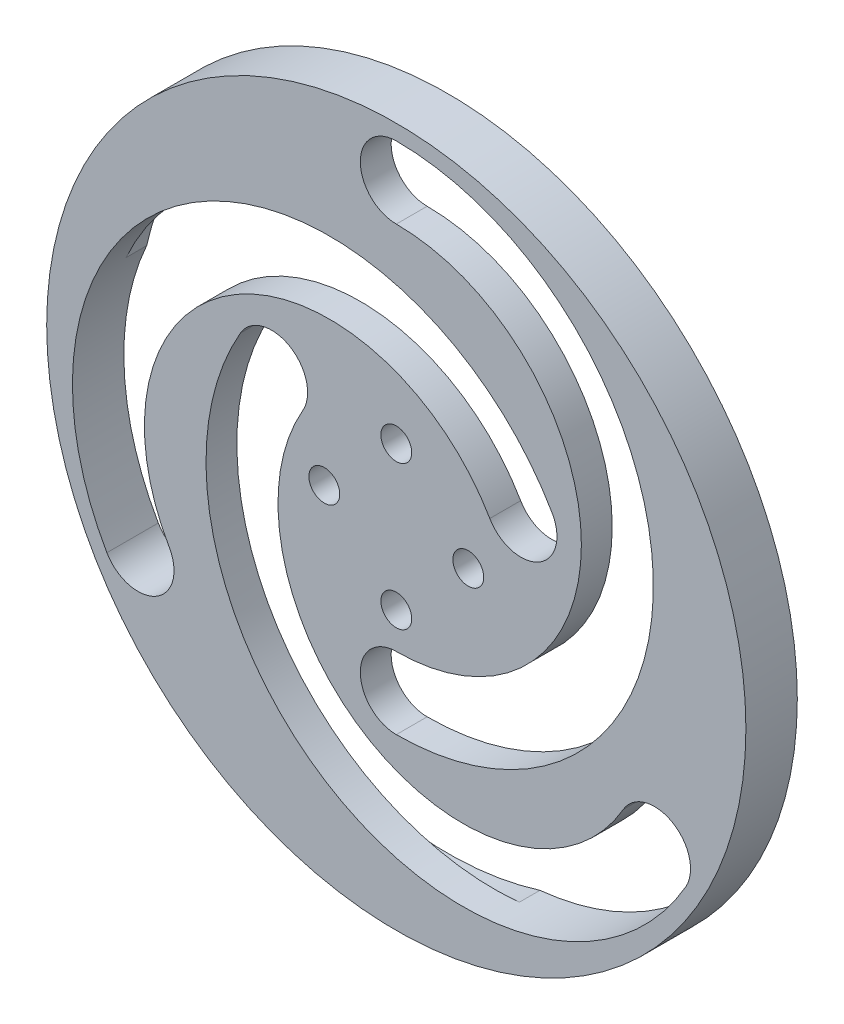
ISO-10303-21;
HEADER;
FILE_DESCRIPTION(('STEP AP214'),'2;1');
FILE_NAME('part.step','',(''),(''),'','','');
FILE_SCHEMA(('AUTOMOTIVE_DESIGN { 1 0 10303 214 1 1 1 1 }'));
ENDSEC;
DATA;
#1=APPLICATION_CONTEXT('core data for automotive mechanical design processes');
#2=APPLICATION_PROTOCOL_DEFINITION('international standard','automotive_design',2000,#1);
#3=PRODUCT_CONTEXT('',#1,'mechanical');
#4=PRODUCT('Part','Part','',(#3));
#5=PRODUCT_RELATED_PRODUCT_CATEGORY('part','',(#4));
#6=PRODUCT_DEFINITION_FORMATION('','',#4);
#7=PRODUCT_DEFINITION_CONTEXT('part definition',#1,'design');
#8=PRODUCT_DEFINITION('design','',#6,#7);
#9=PRODUCT_DEFINITION_SHAPE('','',#8);
#10=(LENGTH_UNIT() NAMED_UNIT(*) SI_UNIT(.MILLI.,.METRE.));
#11=(NAMED_UNIT(*) PLANE_ANGLE_UNIT() SI_UNIT($,.RADIAN.));
#12=(NAMED_UNIT(*) SI_UNIT($,.STERADIAN.) SOLID_ANGLE_UNIT());
#13=UNCERTAINTY_MEASURE_WITH_UNIT(LENGTH_MEASURE(1.E-05),#10,'distance_accuracy_value','');
#14=(GEOMETRIC_REPRESENTATION_CONTEXT(3) GLOBAL_UNCERTAINTY_ASSIGNED_CONTEXT((#13)) GLOBAL_UNIT_ASSIGNED_CONTEXT((#10,
#11,#12)) REPRESENTATION_CONTEXT('',''));
#15=CARTESIAN_POINT('',(0.,0.,0.));
#16=DIRECTION('',(0.,0.,1.));
#17=DIRECTION('',(1.,0.,0.));
#18=AXIS2_PLACEMENT_3D('',#15,#16,#17);
#19=CARTESIAN_POINT('',(0.,7.5,-0.00100000000000013));
#20=DIRECTION('',(0.,0.,1.));
#21=DIRECTION('',(1.,0.,0.));
#22=AXIS2_PLACEMENT_3D('',#19,#20,#21);
#23=CYLINDRICAL_SURFACE('',#22,18.);
#24=CARTESIAN_POINT('',(0.,7.5,2.));
#25=DIRECTION('',(0.,0.,-1.));
#26=DIRECTION('',(-1.,0.,0.));
#27=AXIS2_PLACEMENT_3D('',#24,#25,#26);
#28=CIRCLE('',#27,18.);
#29=CARTESIAN_POINT('',(0.,25.5,2.));
#30=VERTEX_POINT('',#29);
#31=CARTESIAN_POINT('',(0.,-10.5,2.));
#32=VERTEX_POINT('',#31);
#33=EDGE_CURVE('E324',#30,#32,#28,.T.);
#34=ORIENTED_EDGE('',*,*,#33,.F.);
#35=DIRECTION('',(0.,0.,1.));
#36=VECTOR('',#35,1.);
#37=CARTESIAN_POINT('',(0.,25.5,-0.00100000000000013));
#38=LINE('',#37,#36);
#39=CARTESIAN_POINT('',(0.,25.5,5.));
#40=VERTEX_POINT('',#39);
#41=EDGE_CURVE('E307',#30,#40,#38,.T.);
#42=ORIENTED_EDGE('',*,*,#41,.T.);
#43=CARTESIAN_POINT('',(0.,7.5,5.));
#44=DIRECTION('',(0.,0.,1.));
#45=DIRECTION('',(1.,0.,0.));
#46=AXIS2_PLACEMENT_3D('',#43,#44,#45);
#47=CIRCLE('',#46,18.);
#48=CARTESIAN_POINT('',(0.,-10.5,5.));
#49=VERTEX_POINT('',#48);
#50=EDGE_CURVE('E300',#40,#49,#47,.F.);
#51=ORIENTED_EDGE('',*,*,#50,.T.);
#52=DIRECTION('',(0.,0.,1.));
#53=VECTOR('',#52,1.);
#54=CARTESIAN_POINT('',(0.,-10.5,-0.00100000000000013));
#55=LINE('',#54,#53);
#56=EDGE_CURVE('E306',#32,#49,#55,.T.);
#57=ORIENTED_EDGE('',*,*,#56,.F.);
#58=EDGE_LOOP('',(#34,#42,#51,#57));
#59=FACE_BOUND('',#58,.T.);
#60=ADVANCED_FACE('F111',(#59),#23,.T.);
#61=CARTESIAN_POINT('',(-6.49519052838333,-3.74999999999994,-0.00100000000000013));
#62=DIRECTION('',(0.,0.,1.));
#63=DIRECTION('',(1.,0.,0.));
#64=AXIS2_PLACEMENT_3D('',#61,#62,#63);
#65=CYLINDRICAL_SURFACE('',#64,17.9999999999999);
#66=CARTESIAN_POINT('',(-6.49519052838333,-3.74999999999994,2.));
#67=DIRECTION('',(0.,0.,-1.));
#68=DIRECTION('',(-1.,0.,0.));
#69=AXIS2_PLACEMENT_3D('',#66,#67,#68);
#70=CIRCLE('',#69,17.9999999999999);
#71=CARTESIAN_POINT('',(-22.0836477965029,-12.7500000000003,2.));
#72=VERTEX_POINT('',#71);
#73=CARTESIAN_POINT('',(9.09326673973653,5.24999999999985,2.));
#74=VERTEX_POINT('',#73);
#75=EDGE_CURVE('E413',#72,#74,#70,.T.);
#76=ORIENTED_EDGE('',*,*,#75,.F.);
#77=DIRECTION('',(0.,0.,1.));
#78=VECTOR('',#77,1.);
#79=CARTESIAN_POINT('',(-22.0836477965029,-12.7500000000003,-0.00100000000000013));
#80=LINE('',#79,#78);
#81=CARTESIAN_POINT('',(-22.0836477965029,-12.7500000000003,5.));
#82=VERTEX_POINT('',#81);
#83=EDGE_CURVE('E277',#72,#82,#80,.T.);
#84=ORIENTED_EDGE('',*,*,#83,.T.);
#85=CARTESIAN_POINT('',(-6.49519052838333,-3.74999999999994,5.));
#86=DIRECTION('',(0.,0.,1.));
#87=DIRECTION('',(1.,0.,0.));
#88=AXIS2_PLACEMENT_3D('',#85,#86,#87);
#89=CIRCLE('',#88,17.9999999999999);
#90=CARTESIAN_POINT('',(9.09326673973653,5.24999999999984,5.));
#91=VERTEX_POINT('',#90);
#92=EDGE_CURVE('E261',#82,#91,#89,.F.);
#93=ORIENTED_EDGE('',*,*,#92,.T.);
#94=DIRECTION('',(0.,0.,1.));
#95=VECTOR('',#94,1.);
#96=CARTESIAN_POINT('',(9.09326673973653,5.24999999999985,-0.00100000000000013));
#97=LINE('',#96,#95);
#98=EDGE_CURVE('E276',#74,#91,#97,.T.);
#99=ORIENTED_EDGE('',*,*,#98,.F.);
#100=EDGE_LOOP('',(#76,#84,#93,#99));
#101=FACE_BOUND('',#100,.T.);
#102=ADVANCED_FACE('F451',(#101),#65,.T.);
#103=CARTESIAN_POINT('',(6.49519052838327,-3.75000000000003,-0.00100000000000013));
#104=DIRECTION('',(0.,0.,1.));
#105=DIRECTION('',(1.,0.,0.));
#106=AXIS2_PLACEMENT_3D('',#103,#104,#105);
#107=CYLINDRICAL_SURFACE('',#106,18.0000000000001);
#108=CARTESIAN_POINT('',(6.49519052838327,-3.75000000000003,2.));
#109=DIRECTION('',(0.,0.,-1.));
#110=DIRECTION('',(-1.,0.,0.));
#111=AXIS2_PLACEMENT_3D('',#108,#109,#110);
#112=CIRCLE('',#111,18.0000000000001);
#113=CARTESIAN_POINT('',(22.0836477965035,-12.7499999999997,2.));
#114=VERTEX_POINT('',#113);
#115=CARTESIAN_POINT('',(-9.0932667397367,5.25000000000011,2.));
#116=VERTEX_POINT('',#115);
#117=EDGE_CURVE('E421',#114,#116,#112,.T.);
#118=ORIENTED_EDGE('',*,*,#117,.F.);
#119=DIRECTION('',(0.,0.,1.));
#120=VECTOR('',#119,1.);
#121=CARTESIAN_POINT('',(22.0836477965035,-12.7499999999997,-0.00100000000000013));
#122=LINE('',#121,#120);
#123=CARTESIAN_POINT('',(22.0836477965035,-12.7499999999997,5.));
#124=VERTEX_POINT('',#123);
#125=EDGE_CURVE('E292',#114,#124,#122,.T.);
#126=ORIENTED_EDGE('',*,*,#125,.T.);
#127=CARTESIAN_POINT('',(6.49519052838327,-3.75000000000003,5.));
#128=DIRECTION('',(0.,0.,1.));
#129=DIRECTION('',(1.,0.,0.));
#130=AXIS2_PLACEMENT_3D('',#127,#128,#129);
#131=CIRCLE('',#130,18.0000000000001);
#132=CARTESIAN_POINT('',(-9.0932667397367,5.25000000000011,5.));
#133=VERTEX_POINT('',#132);
#134=EDGE_CURVE('E285',#124,#133,#131,.F.);
#135=ORIENTED_EDGE('',*,*,#134,.T.);
#136=DIRECTION('',(0.,0.,1.));
#137=VECTOR('',#136,1.);
#138=CARTESIAN_POINT('',(-9.0932667397367,5.25000000000011,-0.00100000000000013));
#139=LINE('',#138,#137);
#140=EDGE_CURVE('E291',#116,#133,#139,.T.);
#141=ORIENTED_EDGE('',*,*,#140,.F.);
#142=EDGE_LOOP('',(#118,#126,#135,#141));
#143=FACE_BOUND('',#142,.T.);
#144=ADVANCED_FACE('F383',(#143),#107,.T.);
#145=CARTESIAN_POINT('',(0.,7.,5.001));
#146=DIRECTION('',(0.,0.,-1.));
#147=DIRECTION('',(-1.,0.,0.));
#148=AXIS2_PLACEMENT_3D('',#145,#146,#147);
#149=CYLINDRICAL_SURFACE('',#148,1.5);
#150=CARTESIAN_POINT('',(0.,7.,5.));
#151=DIRECTION('',(0.,0.,1.));
#152=DIRECTION('',(1.,0.,0.));
#153=AXIS2_PLACEMENT_3D('',#150,#151,#152);
#154=CIRCLE('',#153,1.5);
#155=CARTESIAN_POINT('',(1.49999999999993,7.,5.));
#156=VERTEX_POINT('',#155);
#157=EDGE_CURVE('E271',#156,#156,#154,.F.);
#158=ORIENTED_EDGE('',*,*,#157,.F.);
#159=EDGE_LOOP('',(#158));
#160=FACE_BOUND('',#159,.T.);
#161=CARTESIAN_POINT('',(0.,7.,2.));
#162=DIRECTION('',(0.,0.,-1.));
#163=DIRECTION('',(-1.,0.,0.));
#164=AXIS2_PLACEMENT_3D('',#161,#162,#163);
#165=CIRCLE('',#164,1.5);
#166=CARTESIAN_POINT('',(-1.50000000000007,7.,2.));
#167=VERTEX_POINT('',#166);
#168=EDGE_CURVE('E387',#167,#167,#165,.F.);
#169=ORIENTED_EDGE('',*,*,#168,.F.);
#170=EDGE_LOOP('',(#169));
#171=FACE_BOUND('',#170,.T.);
#172=ADVANCED_FACE('F379',(#160,#171),#149,.F.);
#173=CARTESIAN_POINT('',(7.,0.,5.001));
#174=DIRECTION('',(0.,0.,-1.));
#175=DIRECTION('',(-1.,0.,0.));
#176=AXIS2_PLACEMENT_3D('',#173,#174,#175);
#177=CYLINDRICAL_SURFACE('',#176,1.5);
#178=CARTESIAN_POINT('',(7.,0.,5.));
#179=DIRECTION('',(0.,0.,1.));
#180=DIRECTION('',(1.,0.,0.));
#181=AXIS2_PLACEMENT_3D('',#178,#179,#180);
#182=CIRCLE('',#181,1.5);
#183=CARTESIAN_POINT('',(8.5,0.,5.));
#184=VERTEX_POINT('',#183);
#185=EDGE_CURVE('E370',#184,#184,#182,.F.);
#186=ORIENTED_EDGE('',*,*,#185,.F.);
#187=EDGE_LOOP('',(#186));
#188=FACE_BOUND('',#187,.T.);
#189=CARTESIAN_POINT('',(7.,0.,2.));
#190=DIRECTION('',(0.,0.,-1.));
#191=DIRECTION('',(-1.,0.,0.));
#192=AXIS2_PLACEMENT_3D('',#189,#190,#191);
#193=CIRCLE('',#192,1.5);
#194=CARTESIAN_POINT('',(5.5,0.,2.));
#195=VERTEX_POINT('',#194);
#196=EDGE_CURVE('E390',#195,#195,#193,.F.);
#197=ORIENTED_EDGE('',*,*,#196,.F.);
#198=EDGE_LOOP('',(#197));
#199=FACE_BOUND('',#198,.T.);
#200=ADVANCED_FACE('F382',(#188,#199),#177,.F.);
#201=CARTESIAN_POINT('',(0.,-7.,5.001));
#202=DIRECTION('',(0.,0.,-1.));
#203=DIRECTION('',(-1.,0.,0.));
#204=AXIS2_PLACEMENT_3D('',#201,#202,#203);
#205=CYLINDRICAL_SURFACE('',#204,1.5);
#206=CARTESIAN_POINT('',(0.,-7.,5.));
#207=DIRECTION('',(0.,0.,1.));
#208=DIRECTION('',(1.,0.,0.));
#209=AXIS2_PLACEMENT_3D('',#206,#207,#208);
#210=CIRCLE('',#209,1.5);
#211=CARTESIAN_POINT('',(1.50000000000002,-7.,5.));
#212=VERTEX_POINT('',#211);
#213=EDGE_CURVE('E268',#212,#212,#210,.F.);
#214=ORIENTED_EDGE('',*,*,#213,.F.);
#215=EDGE_LOOP('',(#214));
#216=FACE_BOUND('',#215,.T.);
#217=CARTESIAN_POINT('',(0.,-7.,2.));
#218=DIRECTION('',(0.,0.,-1.));
#219=DIRECTION('',(-1.,0.,0.));
#220=AXIS2_PLACEMENT_3D('',#217,#218,#219);
#221=CIRCLE('',#220,1.5);
#222=CARTESIAN_POINT('',(-1.49999999999998,-7.,2.));
#223=VERTEX_POINT('',#222);
#224=EDGE_CURVE('E396',#223,#223,#221,.F.);
#225=ORIENTED_EDGE('',*,*,#224,.F.);
#226=EDGE_LOOP('',(#225));
#227=FACE_BOUND('',#226,.T.);
#228=ADVANCED_FACE('F435',(#216,#227),#205,.F.);
#229=CARTESIAN_POINT('',(-7.,0.,5.001));
#230=DIRECTION('',(0.,0.,-1.));
#231=DIRECTION('',(-1.,0.,0.));
#232=AXIS2_PLACEMENT_3D('',#229,#230,#231);
#233=CYLINDRICAL_SURFACE('',#232,1.5);
#234=CARTESIAN_POINT('',(-7.,0.,5.));
#235=DIRECTION('',(0.,0.,1.));
#236=DIRECTION('',(1.,0.,0.));
#237=AXIS2_PLACEMENT_3D('',#234,#235,#236);
#238=CIRCLE('',#237,1.5);
#239=CARTESIAN_POINT('',(-5.5,0.,5.));
#240=VERTEX_POINT('',#239);
#241=EDGE_CURVE('E262',#240,#240,#238,.F.);
#242=ORIENTED_EDGE('',*,*,#241,.F.);
#243=EDGE_LOOP('',(#242));
#244=FACE_BOUND('',#243,.T.);
#245=CARTESIAN_POINT('',(-7.,0.,2.));
#246=DIRECTION('',(0.,0.,-1.));
#247=DIRECTION('',(-1.,0.,0.));
#248=AXIS2_PLACEMENT_3D('',#245,#246,#247);
#249=CIRCLE('',#248,1.5);
#250=CARTESIAN_POINT('',(-8.5,0.,2.));
#251=VERTEX_POINT('',#250);
#252=EDGE_CURVE('E428',#251,#251,#249,.F.);
#253=ORIENTED_EDGE('',*,*,#252,.F.);
#254=EDGE_LOOP('',(#253));
#255=FACE_BOUND('',#254,.T.);
#256=ADVANCED_FACE('F437',(#244,#255),#233,.F.);
#257=CARTESIAN_POINT('',(-12.1243556529822,7.00000000000013,5.001));
#258=DIRECTION('',(0.,0.,-1.));
#259=DIRECTION('',(-1.,0.,0.));
#260=AXIS2_PLACEMENT_3D('',#257,#258,#259);
#261=CYLINDRICAL_SURFACE('',#260,3.5);
#262=CARTESIAN_POINT('',(-12.1243556529822,7.00000000000013,2.));
#263=DIRECTION('',(0.,0.,-1.));
#264=DIRECTION('',(-1.,0.,0.));
#265=AXIS2_PLACEMENT_3D('',#262,#263,#264);
#266=CIRCLE('',#265,3.5);
#267=CARTESIAN_POINT('',(-15.1554445662278,8.75000000000014,2.));
#268=VERTEX_POINT('',#267);
#269=EDGE_CURVE('E423',#116,#268,#266,.F.);
#270=ORIENTED_EDGE('',*,*,#269,.F.);
#271=ORIENTED_EDGE('',*,*,#140,.T.);
#272=CARTESIAN_POINT('',(-12.1243556529822,7.00000000000013,5.));
#273=DIRECTION('',(0.,0.,1.));
#274=DIRECTION('',(1.,0.,0.));
#275=AXIS2_PLACEMENT_3D('',#272,#273,#274);
#276=CIRCLE('',#275,3.5);
#277=CARTESIAN_POINT('',(-15.1554445662278,8.75000000000014,5.));
#278=VERTEX_POINT('',#277);
#279=EDGE_CURVE('E359',#278,#133,#276,.F.);
#280=ORIENTED_EDGE('',*,*,#279,.F.);
#281=DIRECTION('',(0.,0.,1.));
#282=VECTOR('',#281,1.);
#283=CARTESIAN_POINT('',(-15.1554445662278,8.75000000000014,-0.00100000000000013));
#284=LINE('',#283,#282);
#285=EDGE_CURVE('E296',#268,#278,#284,.T.);
#286=ORIENTED_EDGE('',*,*,#285,.F.);
#287=EDGE_LOOP('',(#270,#271,#280,#286));
#288=FACE_BOUND('',#287,.T.);
#289=ADVANCED_FACE('F444',(#288),#261,.F.);
#290=CARTESIAN_POINT('',(12.1243556529821,6.99999999999982,5.001));
#291=DIRECTION('',(0.,0.,-1.));
#292=DIRECTION('',(-1.,0.,0.));
#293=AXIS2_PLACEMENT_3D('',#290,#291,#292);
#294=CYLINDRICAL_SURFACE('',#293,3.5);
#295=CARTESIAN_POINT('',(12.1243556529821,6.99999999999982,2.));
#296=DIRECTION('',(0.,0.,-1.));
#297=DIRECTION('',(-1.,0.,0.));
#298=AXIS2_PLACEMENT_3D('',#295,#296,#297);
#299=CIRCLE('',#298,3.5);
#300=CARTESIAN_POINT('',(15.1554445662276,8.74999999999979,2.));
#301=VERTEX_POINT('',#300);
#302=EDGE_CURVE('E415',#74,#301,#299,.F.);
#303=ORIENTED_EDGE('',*,*,#302,.F.);
#304=ORIENTED_EDGE('',*,*,#98,.T.);
#305=CARTESIAN_POINT('',(12.1243556529821,6.99999999999982,5.));
#306=DIRECTION('',(0.,0.,1.));
#307=DIRECTION('',(1.,0.,0.));
#308=AXIS2_PLACEMENT_3D('',#305,#306,#307);
#309=CIRCLE('',#308,3.5);
#310=CARTESIAN_POINT('',(15.1554445662276,8.74999999999979,5.));
#311=VERTEX_POINT('',#310);
#312=EDGE_CURVE('E356',#311,#91,#309,.F.);
#313=ORIENTED_EDGE('',*,*,#312,.F.);
#314=DIRECTION('',(0.,0.,1.));
#315=VECTOR('',#314,1.);
#316=CARTESIAN_POINT('',(15.1554445662276,8.74999999999979,-0.00100000000000013));
#317=LINE('',#316,#315);
#318=EDGE_CURVE('E281',#301,#311,#317,.T.);
#319=ORIENTED_EDGE('',*,*,#318,.F.);
#320=EDGE_LOOP('',(#303,#304,#313,#319));
#321=FACE_BOUND('',#320,.T.);
#322=ADVANCED_FACE('F517',(#321),#294,.F.);
#323=CARTESIAN_POINT('',(0.,-14.,5.001));
#324=DIRECTION('',(0.,0.,-1.));
#325=DIRECTION('',(-1.,0.,0.));
#326=AXIS2_PLACEMENT_3D('',#323,#324,#325);
#327=CYLINDRICAL_SURFACE('',#326,3.5);
#328=CARTESIAN_POINT('',(0.,-14.,2.));
#329=DIRECTION('',(0.,0.,-1.));
#330=DIRECTION('',(-1.,0.,0.));
#331=AXIS2_PLACEMENT_3D('',#328,#329,#330);
#332=CIRCLE('',#331,3.5);
#333=CARTESIAN_POINT('',(0.,-17.5,2.));
#334=VERTEX_POINT('',#333);
#335=EDGE_CURVE('E331',#32,#334,#332,.F.);
#336=ORIENTED_EDGE('',*,*,#335,.F.);
#337=ORIENTED_EDGE('',*,*,#56,.T.);
#338=CARTESIAN_POINT('',(0.,-14.,5.));
#339=DIRECTION('',(0.,0.,1.));
#340=DIRECTION('',(1.,0.,0.));
#341=AXIS2_PLACEMENT_3D('',#338,#339,#340);
#342=CIRCLE('',#341,3.5);
#343=CARTESIAN_POINT('',(0.,-17.5,5.));
#344=VERTEX_POINT('',#343);
#345=EDGE_CURVE('E345',#344,#49,#342,.F.);
#346=ORIENTED_EDGE('',*,*,#345,.F.);
#347=DIRECTION('',(0.,0.,1.));
#348=VECTOR('',#347,1.);
#349=CARTESIAN_POINT('',(0.,-17.5,-0.00100000000000013));
#350=LINE('',#349,#348);
#351=EDGE_CURVE('E312',#334,#344,#350,.T.);
#352=ORIENTED_EDGE('',*,*,#351,.F.);
#353=EDGE_LOOP('',(#336,#337,#346,#352));
#354=FACE_BOUND('',#353,.T.);
#355=ADVANCED_FACE('F407',(#354),#327,.F.);
#356=CARTESIAN_POINT('',(0.,0.,5.));
#357=DIRECTION('',(0.,0.,-1.));
#358=DIRECTION('',(-1.,0.,0.));
#359=AXIS2_PLACEMENT_3D('',#356,#357,#358);
#360=CYLINDRICAL_SURFACE('',#359,34.);
#361=CARTESIAN_POINT('',(0.,0.,5.));
#362=DIRECTION('',(0.,0.,1.));
#363=DIRECTION('',(1.,0.,0.));
#364=AXIS2_PLACEMENT_3D('',#361,#362,#363);
#365=CIRCLE('',#364,34.);
#366=CARTESIAN_POINT('',(34.,0.,5.));
#367=VERTEX_POINT('',#366);
#368=EDGE_CURVE('E315',#367,#367,#365,.T.);
#369=ORIENTED_EDGE('',*,*,#368,.F.);
#370=EDGE_LOOP('',(#369));
#371=FACE_BOUND('',#370,.T.);
#372=CARTESIAN_POINT('',(0.,0.,0.));
#373=DIRECTION('',(0.,0.,1.));
#374=DIRECTION('',(1.,0.,0.));
#375=AXIS2_PLACEMENT_3D('',#372,#373,#374);
#376=CIRCLE('',#375,34.);
#377=CARTESIAN_POINT('',(34.,0.,0.));
#378=VERTEX_POINT('',#377);
#379=EDGE_CURVE('E309',#378,#378,#376,.T.);
#380=ORIENTED_EDGE('',*,*,#379,.T.);
#381=EDGE_LOOP('',(#380));
#382=FACE_BOUND('',#381,.T.);
#383=ADVANCED_FACE('F113',(#371,#382),#360,.T.);
#384=CARTESIAN_POINT('',(0.,0.,5.));
#385=DIRECTION('',(0.,0.,1.));
#386=DIRECTION('',(1.,0.,0.));
#387=AXIS2_PLACEMENT_3D('',#384,#385,#386);
#388=PLANE('',#387);
#389=CARTESIAN_POINT('',(0.,29.,5.));
#390=DIRECTION('',(0.,0.,1.));
#391=DIRECTION('',(1.,0.,0.));
#392=AXIS2_PLACEMENT_3D('',#389,#390,#391);
#393=CIRCLE('',#392,3.5);
#394=CARTESIAN_POINT('',(0.,32.5,5.));
#395=VERTEX_POINT('',#394);
#396=EDGE_CURVE('E335',#40,#395,#393,.F.);
#397=ORIENTED_EDGE('',*,*,#396,.T.);
#398=CARTESIAN_POINT('',(0.,7.5,5.));
#399=DIRECTION('',(0.,0.,1.));
#400=DIRECTION('',(1.,0.,0.));
#401=AXIS2_PLACEMENT_3D('',#398,#399,#400);
#402=CIRCLE('',#401,25.);
#403=EDGE_CURVE('E303',#395,#344,#402,.F.);
#404=ORIENTED_EDGE('',*,*,#403,.T.);
#405=ORIENTED_EDGE('',*,*,#345,.T.);
#406=ORIENTED_EDGE('',*,*,#50,.F.);
#407=EDGE_LOOP('',(#397,#404,#405,#406));
#408=FACE_BOUND('',#407,.T.);
#409=CARTESIAN_POINT('',(25.1147367097491,-14.4999999999996,5.));
#410=DIRECTION('',(0.,0.,1.));
#411=DIRECTION('',(1.,0.,0.));
#412=AXIS2_PLACEMENT_3D('',#409,#410,#411);
#413=CIRCLE('',#412,3.5);
#414=CARTESIAN_POINT('',(28.1458256229947,-16.2499999999996,5.));
#415=VERTEX_POINT('',#414);
#416=EDGE_CURVE('E351',#124,#415,#413,.F.);
#417=ORIENTED_EDGE('',*,*,#416,.T.);
#418=CARTESIAN_POINT('',(6.49519052838327,-3.75000000000003,5.));
#419=DIRECTION('',(0.,0.,1.));
#420=DIRECTION('',(1.,0.,0.));
#421=AXIS2_PLACEMENT_3D('',#418,#419,#420);
#422=CIRCLE('',#421,25.0000000000001);
#423=EDGE_CURVE('E288',#415,#278,#422,.F.);
#424=ORIENTED_EDGE('',*,*,#423,.T.);
#425=ORIENTED_EDGE('',*,*,#279,.T.);
#426=ORIENTED_EDGE('',*,*,#134,.F.);
#427=EDGE_LOOP('',(#417,#424,#425,#426));
#428=FACE_BOUND('',#427,.T.);
#429=CARTESIAN_POINT('',(-25.1147367097484,-14.5000000000004,5.));
#430=DIRECTION('',(0.,0.,1.));
#431=DIRECTION('',(1.,0.,0.));
#432=AXIS2_PLACEMENT_3D('',#429,#430,#431);
#433=CIRCLE('',#432,3.5);
#434=CARTESIAN_POINT('',(-28.1458256229939,-16.2500000000004,5.));
#435=VERTEX_POINT('',#434);
#436=EDGE_CURVE('E362',#82,#435,#433,.F.);
#437=ORIENTED_EDGE('',*,*,#436,.T.);
#438=CARTESIAN_POINT('',(-6.49519052838333,-3.74999999999994,5.));
#439=DIRECTION('',(0.,0.,1.));
#440=DIRECTION('',(1.,0.,0.));
#441=AXIS2_PLACEMENT_3D('',#438,#439,#440);
#442=CIRCLE('',#441,24.9999999999999);
#443=EDGE_CURVE('E265',#435,#311,#442,.F.);
#444=ORIENTED_EDGE('',*,*,#443,.T.);
#445=ORIENTED_EDGE('',*,*,#312,.T.);
#446=ORIENTED_EDGE('',*,*,#92,.F.);
#447=EDGE_LOOP('',(#437,#444,#445,#446));
#448=FACE_BOUND('',#447,.T.);
#449=ORIENTED_EDGE('',*,*,#241,.T.);
#450=EDGE_LOOP('',(#449));
#451=FACE_BOUND('',#450,.T.);
#452=ORIENTED_EDGE('',*,*,#213,.T.);
#453=EDGE_LOOP('',(#452));
#454=FACE_BOUND('',#453,.T.);
#455=ORIENTED_EDGE('',*,*,#185,.T.);
#456=EDGE_LOOP('',(#455));
#457=FACE_BOUND('',#456,.T.);
#458=ORIENTED_EDGE('',*,*,#157,.T.);
#459=EDGE_LOOP('',(#458));
#460=FACE_BOUND('',#459,.T.);
#461=ORIENTED_EDGE('',*,*,#368,.T.);
#462=EDGE_LOOP('',(#461));
#463=FACE_BOUND('',#462,.T.);
#464=ADVANCED_FACE('F342',(#408,#428,#448,#451,#454,#457,#460,#463),#388,.T.);
#465=CARTESIAN_POINT('',(0.,0.,0.));
#466=DIRECTION('',(0.,0.,1.));
#467=DIRECTION('',(1.,0.,0.));
#468=AXIS2_PLACEMENT_3D('',#465,#466,#467);
#469=PLANE('',#468);
#470=CARTESIAN_POINT('',(0.,29.,0.));
#471=DIRECTION('',(0.,0.,-1.));
#472=DIRECTION('',(-1.,0.,0.));
#473=AXIS2_PLACEMENT_3D('',#470,#471,#472);
#474=CIRCLE('',#473,3.5);
#475=CARTESIAN_POINT('',(-3.40592254941361,29.8060344827586,0.));
#476=VERTEX_POINT('',#475);
#477=CARTESIAN_POINT('',(0.,32.5,0.));
#478=VERTEX_POINT('',#477);
#479=EDGE_CURVE('E252',#476,#478,#474,.T.);
#480=ORIENTED_EDGE('',*,*,#479,.F.);
#481=CARTESIAN_POINT('',(0.,0.,0.));
#482=DIRECTION('',(0.,0.,-1.));
#483=DIRECTION('',(-1.,0.,0.));
#484=AXIS2_PLACEMENT_3D('',#481,#482,#483);
#485=CIRCLE('',#484,30.);
#486=CARTESIAN_POINT('',(-29.2776384427491,6.543690641806,0.));
#487=VERTEX_POINT('',#486);
#488=EDGE_CURVE('E240',#487,#476,#485,.T.);
#489=ORIENTED_EDGE('',*,*,#488,.F.);
#490=CARTESIAN_POINT('',(-6.49519052838333,-3.74999999999994,0.));
#491=DIRECTION('',(0.,0.,1.));
#492=DIRECTION('',(1.,0.,0.));
#493=AXIS2_PLACEMENT_3D('',#490,#491,#492);
#494=CIRCLE('',#493,24.9999999999999);
#495=CARTESIAN_POINT('',(-28.1458256229939,-16.2500000000004,0.));
#496=VERTEX_POINT('',#495);
#497=EDGE_CURVE('E250',#487,#496,#494,.T.);
#498=ORIENTED_EDGE('',*,*,#497,.T.);
#499=CARTESIAN_POINT('',(-25.1147367097484,-14.5000000000004,0.));
#500=DIRECTION('',(0.,0.,-1.));
#501=DIRECTION('',(-1.,0.,0.));
#502=AXIS2_PLACEMENT_3D('',#499,#500,#501);
#503=CIRCLE('',#502,3.5);
#504=CARTESIAN_POINT('',(-24.1098217734369,-17.8526326924941,0.));
#505=VERTEX_POINT('',#504);
#506=EDGE_CURVE('E363',#505,#496,#503,.T.);
#507=ORIENTED_EDGE('',*,*,#506,.F.);
#508=CARTESIAN_POINT('',(8.9718168910629,-28.62702397514,0.));
#509=VERTEX_POINT('',#508);
#510=EDGE_CURVE('E256',#509,#505,#485,.T.);
#511=ORIENTED_EDGE('',*,*,#510,.F.);
#512=CARTESIAN_POINT('',(6.49519052838327,-3.75000000000003,0.));
#513=DIRECTION('',(0.,0.,1.));
#514=DIRECTION('',(1.,0.,0.));
#515=AXIS2_PLACEMENT_3D('',#512,#513,#514);
#516=CIRCLE('',#515,25.0000000000001);
#517=CARTESIAN_POINT('',(28.1458256229947,-16.2499999999996,0.));
#518=VERTEX_POINT('',#517);
#519=EDGE_CURVE('E279',#509,#518,#516,.T.);
#520=ORIENTED_EDGE('',*,*,#519,.T.);
#521=CARTESIAN_POINT('',(25.1147367097491,-14.4999999999996,0.));
#522=DIRECTION('',(0.,0.,-1.));
#523=DIRECTION('',(-1.,0.,0.));
#524=AXIS2_PLACEMENT_3D('',#521,#522,#523);
#525=CIRCLE('',#524,3.5);
#526=CARTESIAN_POINT('',(27.515744322851,-11.9534017902644,0.));
#527=VERTEX_POINT('',#526);
#528=EDGE_CURVE('E348',#527,#518,#525,.T.);
#529=ORIENTED_EDGE('',*,*,#528,.F.);
#530=CARTESIAN_POINT('',(20.3058215516853,22.0833333333333,0.));
#531=VERTEX_POINT('',#530);
#532=EDGE_CURVE('E254',#531,#527,#485,.T.);
#533=ORIENTED_EDGE('',*,*,#532,.F.);
#534=CARTESIAN_POINT('',(0.,7.5,0.));
#535=DIRECTION('',(0.,0.,1.));
#536=DIRECTION('',(1.,0.,0.));
#537=AXIS2_PLACEMENT_3D('',#534,#535,#536);
#538=CIRCLE('',#537,25.);
#539=EDGE_CURVE('E134',#531,#478,#538,.T.);
#540=ORIENTED_EDGE('',*,*,#539,.T.);
#541=EDGE_LOOP('',(#480,#489,#498,#507,#511,#520,#529,#533,#540));
#542=FACE_BOUND('',#541,.T.);
#543=ORIENTED_EDGE('',*,*,#379,.F.);
#544=EDGE_LOOP('',(#543));
#545=FACE_BOUND('',#544,.T.);
#546=ADVANCED_FACE('F247',(#542,#545),#469,.F.);
#547=CARTESIAN_POINT('',(0.,7.5,-0.00100000000000013));
#548=DIRECTION('',(0.,0.,1.));
#549=DIRECTION('',(1.,0.,0.));
#550=AXIS2_PLACEMENT_3D('',#547,#548,#549);
#551=CYLINDRICAL_SURFACE('',#550,25.);
#552=DIRECTION('',(0.,0.,-1.));
#553=VECTOR('',#552,1.);
#554=CARTESIAN_POINT('',(20.3058215516853,22.0833333333333,1.));
#555=LINE('',#554,#553);
#556=CARTESIAN_POINT('',(20.3058215516853,22.0833333333333,2.));
#557=VERTEX_POINT('',#556);
#558=EDGE_CURVE('E244',#557,#531,#555,.T.);
#559=ORIENTED_EDGE('',*,*,#558,.F.);
#560=CARTESIAN_POINT('',(0.,7.5,2.));
#561=DIRECTION('',(0.,0.,-1.));
#562=DIRECTION('',(-1.,0.,0.));
#563=AXIS2_PLACEMENT_3D('',#560,#561,#562);
#564=CIRCLE('',#563,25.);
#565=EDGE_CURVE('E406',#557,#334,#564,.T.);
#566=ORIENTED_EDGE('',*,*,#565,.T.);
#567=ORIENTED_EDGE('',*,*,#351,.T.);
#568=ORIENTED_EDGE('',*,*,#403,.F.);
#569=DIRECTION('',(0.,0.,1.));
#570=VECTOR('',#569,1.);
#571=CARTESIAN_POINT('',(0.,32.5,-0.00100000000000013));
#572=LINE('',#571,#570);
#573=EDGE_CURVE('E310',#478,#395,#572,.T.);
#574=ORIENTED_EDGE('',*,*,#573,.F.);
#575=ORIENTED_EDGE('',*,*,#539,.F.);
#576=EDGE_LOOP('',(#559,#566,#567,#568,#574,#575));
#577=FACE_BOUND('',#576,.T.);
#578=ADVANCED_FACE('F404',(#577),#551,.F.);
#579=CARTESIAN_POINT('',(-6.49519052838333,-3.74999999999994,-0.00100000000000013));
#580=DIRECTION('',(0.,0.,1.));
#581=DIRECTION('',(1.,0.,0.));
#582=AXIS2_PLACEMENT_3D('',#579,#580,#581);
#583=CYLINDRICAL_SURFACE('',#582,24.9999999999999);
#584=DIRECTION('',(0.,0.,-1.));
#585=VECTOR('',#584,1.);
#586=CARTESIAN_POINT('',(-29.2776384427491,6.543690641806,1.));
#587=LINE('',#586,#585);
#588=CARTESIAN_POINT('',(-29.2776384427491,6.543690641806,2.));
#589=VERTEX_POINT('',#588);
#590=EDGE_CURVE('E237',#589,#487,#587,.T.);
#591=ORIENTED_EDGE('',*,*,#590,.F.);
#592=CARTESIAN_POINT('',(-6.49519052838333,-3.74999999999994,2.));
#593=DIRECTION('',(0.,0.,-1.));
#594=DIRECTION('',(-1.,0.,0.));
#595=AXIS2_PLACEMENT_3D('',#592,#593,#594);
#596=CIRCLE('',#595,24.9999999999999);
#597=EDGE_CURVE('E417',#589,#301,#596,.T.);
#598=ORIENTED_EDGE('',*,*,#597,.T.);
#599=ORIENTED_EDGE('',*,*,#318,.T.);
#600=ORIENTED_EDGE('',*,*,#443,.F.);
#601=DIRECTION('',(0.,0.,1.));
#602=VECTOR('',#601,1.);
#603=CARTESIAN_POINT('',(-28.1458256229939,-16.2500000000004,-0.00100000000000013));
#604=LINE('',#603,#602);
#605=EDGE_CURVE('E260',#496,#435,#604,.T.);
#606=ORIENTED_EDGE('',*,*,#605,.F.);
#607=ORIENTED_EDGE('',*,*,#497,.F.);
#608=EDGE_LOOP('',(#591,#598,#599,#600,#606,#607));
#609=FACE_BOUND('',#608,.T.);
#610=ADVANCED_FACE('F258',(#609),#583,.F.);
#611=CARTESIAN_POINT('',(6.49519052838327,-3.75000000000003,-0.00100000000000013));
#612=DIRECTION('',(0.,0.,1.));
#613=DIRECTION('',(1.,0.,0.));
#614=AXIS2_PLACEMENT_3D('',#611,#612,#613);
#615=CYLINDRICAL_SURFACE('',#614,25.0000000000001);
#616=DIRECTION('',(0.,0.,-1.));
#617=VECTOR('',#616,1.);
#618=CARTESIAN_POINT('',(8.97181689106291,-28.62702397514,1.));
#619=LINE('',#618,#617);
#620=CARTESIAN_POINT('',(8.9718168910629,-28.62702397514,2.));
#621=VERTEX_POINT('',#620);
#622=EDGE_CURVE('E245',#621,#509,#619,.T.);
#623=ORIENTED_EDGE('',*,*,#622,.F.);
#624=CARTESIAN_POINT('',(6.49519052838327,-3.75000000000003,2.));
#625=DIRECTION('',(0.,0.,-1.));
#626=DIRECTION('',(-1.,0.,0.));
#627=AXIS2_PLACEMENT_3D('',#624,#625,#626);
#628=CIRCLE('',#627,25.0000000000001);
#629=EDGE_CURVE('E425',#621,#268,#628,.T.);
#630=ORIENTED_EDGE('',*,*,#629,.T.);
#631=ORIENTED_EDGE('',*,*,#285,.T.);
#632=ORIENTED_EDGE('',*,*,#423,.F.);
#633=DIRECTION('',(0.,0.,1.));
#634=VECTOR('',#633,1.);
#635=CARTESIAN_POINT('',(28.1458256229947,-16.2499999999996,-0.00100000000000013));
#636=LINE('',#635,#634);
#637=EDGE_CURVE('E294',#518,#415,#636,.T.);
#638=ORIENTED_EDGE('',*,*,#637,.F.);
#639=ORIENTED_EDGE('',*,*,#519,.F.);
#640=EDGE_LOOP('',(#623,#630,#631,#632,#638,#639));
#641=FACE_BOUND('',#640,.T.);
#642=ADVANCED_FACE('F470',(#641),#615,.F.);
#643=CARTESIAN_POINT('',(25.1147367097491,-14.4999999999996,5.001));
#644=DIRECTION('',(0.,0.,-1.));
#645=DIRECTION('',(-1.,0.,0.));
#646=AXIS2_PLACEMENT_3D('',#643,#644,#645);
#647=CYLINDRICAL_SURFACE('',#646,3.5);
#648=CARTESIAN_POINT('',(25.1147367097491,-14.4999999999996,2.));
#649=DIRECTION('',(0.,0.,-1.));
#650=DIRECTION('',(-1.,0.,0.));
#651=AXIS2_PLACEMENT_3D('',#648,#649,#650);
#652=CIRCLE('',#651,3.5);
#653=CARTESIAN_POINT('',(27.515744322851,-11.9534017902644,2.));
#654=VERTEX_POINT('',#653);
#655=EDGE_CURVE('E419',#654,#114,#652,.F.);
#656=ORIENTED_EDGE('',*,*,#655,.F.);
#657=DIRECTION('',(0.,0.,-1.));
#658=VECTOR('',#657,1.);
#659=CARTESIAN_POINT('',(27.515744322851,-11.9534017902644,1.));
#660=LINE('',#659,#658);
#661=EDGE_CURVE('E393',#654,#527,#660,.T.);
#662=ORIENTED_EDGE('',*,*,#661,.T.);
#663=ORIENTED_EDGE('',*,*,#528,.T.);
#664=ORIENTED_EDGE('',*,*,#637,.T.);
#665=ORIENTED_EDGE('',*,*,#416,.F.);
#666=ORIENTED_EDGE('',*,*,#125,.F.);
#667=EDGE_LOOP('',(#656,#662,#663,#664,#665,#666));
#668=FACE_BOUND('',#667,.T.);
#669=ADVANCED_FACE('F475',(#668),#647,.F.);
#670=CARTESIAN_POINT('',(-25.1147367097484,-14.5000000000004,5.001));
#671=DIRECTION('',(0.,0.,-1.));
#672=DIRECTION('',(-1.,0.,0.));
#673=AXIS2_PLACEMENT_3D('',#670,#671,#672);
#674=CYLINDRICAL_SURFACE('',#673,3.5);
#675=CARTESIAN_POINT('',(-25.1147367097484,-14.5000000000004,2.));
#676=DIRECTION('',(0.,0.,-1.));
#677=DIRECTION('',(-1.,0.,0.));
#678=AXIS2_PLACEMENT_3D('',#675,#676,#677);
#679=CIRCLE('',#678,3.5);
#680=CARTESIAN_POINT('',(-24.1098217734369,-17.8526326924941,2.));
#681=VERTEX_POINT('',#680);
#682=EDGE_CURVE('E409',#681,#72,#679,.F.);
#683=ORIENTED_EDGE('',*,*,#682,.F.);
#684=DIRECTION('',(0.,0.,-1.));
#685=VECTOR('',#684,1.);
#686=CARTESIAN_POINT('',(-24.1098217734369,-17.8526326924941,1.));
#687=LINE('',#686,#685);
#688=EDGE_CURVE('E389',#681,#505,#687,.T.);
#689=ORIENTED_EDGE('',*,*,#688,.T.);
#690=ORIENTED_EDGE('',*,*,#506,.T.);
#691=ORIENTED_EDGE('',*,*,#605,.T.);
#692=ORIENTED_EDGE('',*,*,#436,.F.);
#693=ORIENTED_EDGE('',*,*,#83,.F.);
#694=EDGE_LOOP('',(#683,#689,#690,#691,#692,#693));
#695=FACE_BOUND('',#694,.T.);
#696=ADVANCED_FACE('F510',(#695),#674,.F.);
#697=CARTESIAN_POINT('',(0.,29.,5.001));
#698=DIRECTION('',(0.,0.,-1.));
#699=DIRECTION('',(-1.,0.,0.));
#700=AXIS2_PLACEMENT_3D('',#697,#698,#699);
#701=CYLINDRICAL_SURFACE('',#700,3.5);
#702=CARTESIAN_POINT('',(0.,29.,2.));
#703=DIRECTION('',(0.,0.,-1.));
#704=DIRECTION('',(-1.,0.,0.));
#705=AXIS2_PLACEMENT_3D('',#702,#703,#704);
#706=CIRCLE('',#705,3.5);
#707=CARTESIAN_POINT('',(-3.40592254941361,29.8060344827586,2.));
#708=VERTEX_POINT('',#707);
#709=EDGE_CURVE('E119',#708,#30,#706,.F.);
#710=ORIENTED_EDGE('',*,*,#709,.F.);
#711=DIRECTION('',(0.,0.,-1.));
#712=VECTOR('',#711,1.);
#713=CARTESIAN_POINT('',(-3.4059225494136,29.8060344827586,1.));
#714=LINE('',#713,#712);
#715=EDGE_CURVE('E12',#708,#476,#714,.T.);
#716=ORIENTED_EDGE('',*,*,#715,.T.);
#717=ORIENTED_EDGE('',*,*,#479,.T.);
#718=ORIENTED_EDGE('',*,*,#573,.T.);
#719=ORIENTED_EDGE('',*,*,#396,.F.);
#720=ORIENTED_EDGE('',*,*,#41,.F.);
#721=EDGE_LOOP('',(#710,#716,#717,#718,#719,#720));
#722=FACE_BOUND('',#721,.T.);
#723=ADVANCED_FACE('F333',(#722),#701,.F.);
#724=CARTESIAN_POINT('',(0.,0.,2.));
#725=DIRECTION('',(0.,0.,-1.));
#726=DIRECTION('',(-1.,0.,0.));
#727=AXIS2_PLACEMENT_3D('',#724,#725,#726);
#728=CYLINDRICAL_SURFACE('',#727,30.);
#729=ORIENTED_EDGE('',*,*,#558,.T.);
#730=ORIENTED_EDGE('',*,*,#532,.T.);
#731=ORIENTED_EDGE('',*,*,#661,.F.);
#732=CARTESIAN_POINT('',(0.,0.,2.));
#733=DIRECTION('',(0.,0.,-1.));
#734=DIRECTION('',(-1.,0.,0.));
#735=AXIS2_PLACEMENT_3D('',#732,#733,#734);
#736=CIRCLE('',#735,30.);
#737=EDGE_CURVE('E504',#557,#654,#736,.T.);
#738=ORIENTED_EDGE('',*,*,#737,.F.);
#739=EDGE_LOOP('',(#729,#730,#731,#738));
#740=FACE_BOUND('',#739,.T.);
#741=ADVANCED_FACE('F531',(#740),#728,.F.);
#742=ORIENTED_EDGE('',*,*,#622,.T.);
#743=ORIENTED_EDGE('',*,*,#510,.T.);
#744=ORIENTED_EDGE('',*,*,#688,.F.);
#745=EDGE_CURVE('E253',#621,#681,#736,.T.);
#746=ORIENTED_EDGE('',*,*,#745,.F.);
#747=EDGE_LOOP('',(#742,#743,#744,#746));
#748=FACE_BOUND('',#747,.T.);
#749=ADVANCED_FACE('F501',(#748),#728,.F.);
#750=CARTESIAN_POINT('',(0.,0.,2.));
#751=DIRECTION('',(0.,0.,-1.));
#752=DIRECTION('',(-1.,0.,0.));
#753=AXIS2_PLACEMENT_3D('',#750,#751,#752);
#754=PLANE('',#753);
#755=ORIENTED_EDGE('',*,*,#745,.T.);
#756=ORIENTED_EDGE('',*,*,#682,.T.);
#757=ORIENTED_EDGE('',*,*,#75,.T.);
#758=ORIENTED_EDGE('',*,*,#302,.T.);
#759=ORIENTED_EDGE('',*,*,#597,.F.);
#760=EDGE_CURVE('E126',#589,#708,#736,.T.);
#761=ORIENTED_EDGE('',*,*,#760,.T.);
#762=ORIENTED_EDGE('',*,*,#709,.T.);
#763=ORIENTED_EDGE('',*,*,#33,.T.);
#764=ORIENTED_EDGE('',*,*,#335,.T.);
#765=ORIENTED_EDGE('',*,*,#565,.F.);
#766=ORIENTED_EDGE('',*,*,#737,.T.);
#767=ORIENTED_EDGE('',*,*,#655,.T.);
#768=ORIENTED_EDGE('',*,*,#117,.T.);
#769=ORIENTED_EDGE('',*,*,#269,.T.);
#770=ORIENTED_EDGE('',*,*,#629,.F.);
#771=EDGE_LOOP('',(#755,#756,#757,#758,#759,#761,#762,#763,#764,#765,#766,#767,#768,#769,#770));
#772=FACE_BOUND('',#771,.T.);
#773=ORIENTED_EDGE('',*,*,#252,.T.);
#774=EDGE_LOOP('',(#773));
#775=FACE_BOUND('',#774,.T.);
#776=ORIENTED_EDGE('',*,*,#224,.T.);
#777=EDGE_LOOP('',(#776));
#778=FACE_BOUND('',#777,.T.);
#779=ORIENTED_EDGE('',*,*,#196,.T.);
#780=EDGE_LOOP('',(#779));
#781=FACE_BOUND('',#780,.T.);
#782=ORIENTED_EDGE('',*,*,#168,.T.);
#783=EDGE_LOOP('',(#782));
#784=FACE_BOUND('',#783,.T.);
#785=ADVANCED_FACE('F322',(#772,#775,#778,#781,#784),#754,.T.);
#786=ORIENTED_EDGE('',*,*,#590,.T.);
#787=ORIENTED_EDGE('',*,*,#488,.T.);
#788=ORIENTED_EDGE('',*,*,#715,.F.);
#789=ORIENTED_EDGE('',*,*,#760,.F.);
#790=EDGE_LOOP('',(#786,#787,#788,#789));
#791=FACE_BOUND('',#790,.T.);
#792=ADVANCED_FACE('F239',(#791),#728,.F.);
#793=CLOSED_SHELL('',(#60,#102,#144,#172,#200,#228,#256,#289,#322,#355,#383,#464,#546,#578,#610,
#642,#669,#696,#723,#741,#749,#785,#792));
#794=MANIFOLD_SOLID_BREP('B2',#793);
#795=ADVANCED_BREP_SHAPE_REPRESENTATION('',(#18,#794),#14);
#796=SHAPE_DEFINITION_REPRESENTATION(#9,#795);
ENDSEC;
END-ISO-10303-21;
